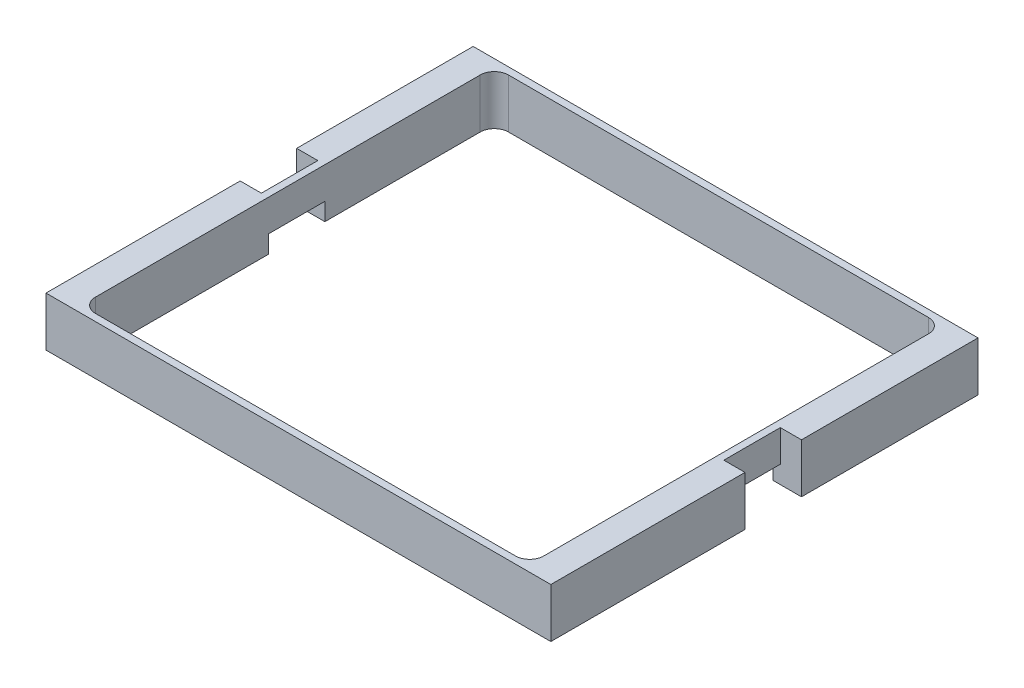
ISO-10303-21;
HEADER;
FILE_DESCRIPTION(('STEP AP214'),'2;1');
FILE_NAME('part.step','',(''),(''),'','','');
FILE_SCHEMA(('AUTOMOTIVE_DESIGN { 1 0 10303 214 1 1 1 1 }'));
ENDSEC;
DATA;
#1=APPLICATION_CONTEXT('core data for automotive mechanical design processes');
#2=APPLICATION_PROTOCOL_DEFINITION('international standard','automotive_design',2000,#1);
#3=PRODUCT_CONTEXT('',#1,'mechanical');
#4=PRODUCT('Part','Part','',(#3));
#5=PRODUCT_RELATED_PRODUCT_CATEGORY('part','',(#4));
#6=PRODUCT_DEFINITION_FORMATION('','',#4);
#7=PRODUCT_DEFINITION_CONTEXT('part definition',#1,'design');
#8=PRODUCT_DEFINITION('design','',#6,#7);
#9=PRODUCT_DEFINITION_SHAPE('','',#8);
#10=(LENGTH_UNIT() NAMED_UNIT(*) SI_UNIT(.MILLI.,.METRE.));
#11=(NAMED_UNIT(*) PLANE_ANGLE_UNIT() SI_UNIT($,.RADIAN.));
#12=(NAMED_UNIT(*) SI_UNIT($,.STERADIAN.) SOLID_ANGLE_UNIT());
#13=UNCERTAINTY_MEASURE_WITH_UNIT(LENGTH_MEASURE(1.E-05),#10,'distance_accuracy_value','');
#14=(GEOMETRIC_REPRESENTATION_CONTEXT(3) GLOBAL_UNCERTAINTY_ASSIGNED_CONTEXT((#13)) GLOBAL_UNIT_ASSIGNED_CONTEXT((#10,
#11,#12)) REPRESENTATION_CONTEXT('',''));
#15=CARTESIAN_POINT('',(0.,0.,0.));
#16=DIRECTION('',(0.,0.,1.));
#17=DIRECTION('',(1.,0.,0.));
#18=AXIS2_PLACEMENT_3D('',#15,#16,#17);
#19=CARTESIAN_POINT('',(0.,0.,0.));
#20=DIRECTION('',(0.,1.,0.));
#21=DIRECTION('',(0.,0.,1.));
#22=AXIS2_PLACEMENT_3D('',#19,#20,#21);
#23=PLANE('',#22);
#24=DIRECTION('',(1.,0.,0.));
#25=VECTOR('',#24,1.);
#26=CARTESIAN_POINT('',(-4.,0.,32.));
#27=LINE('',#26,#25);
#28=CARTESIAN_POINT('',(-4.,0.,32.));
#29=VERTEX_POINT('',#28);
#30=CARTESIAN_POINT('',(0.,0.,32.));
#31=VERTEX_POINT('',#30);
#32=EDGE_CURVE('E62',#29,#31,#27,.T.);
#33=ORIENTED_EDGE('',*,*,#32,.T.);
#34=DIRECTION('',(0.,0.,1.));
#35=VECTOR('',#34,1.);
#36=CARTESIAN_POINT('',(0.,0.,0.));
#37=LINE('',#36,#35);
#38=CARTESIAN_POINT('',(0.,0.,56.5));
#39=VERTEX_POINT('',#38);
#40=EDGE_CURVE('E262',#31,#39,#37,.T.);
#41=ORIENTED_EDGE('',*,*,#40,.T.);
#42=CARTESIAN_POINT('',(2.00000000000001,0.,56.5));
#43=DIRECTION('',(0.,1.,0.));
#44=DIRECTION('',(0.,0.,1.));
#45=AXIS2_PLACEMENT_3D('',#42,#43,#44);
#46=CIRCLE('',#45,2.);
#47=CARTESIAN_POINT('',(2.00000000000001,0.,58.5));
#48=VERTEX_POINT('',#47);
#49=EDGE_CURVE('E330',#39,#48,#46,.T.);
#50=ORIENTED_EDGE('',*,*,#49,.T.);
#51=DIRECTION('',(1.,0.,0.));
#52=VECTOR('',#51,1.);
#53=CARTESIAN_POINT('',(0.,0.,58.5));
#54=LINE('',#53,#52);
#55=CARTESIAN_POINT('',(61.5,0.,58.5));
#56=VERTEX_POINT('',#55);
#57=EDGE_CURVE('E261',#48,#56,#54,.T.);
#58=ORIENTED_EDGE('',*,*,#57,.T.);
#59=CARTESIAN_POINT('',(61.5,0.,56.5));
#60=DIRECTION('',(0.,1.,0.));
#61=DIRECTION('',(0.,0.,1.));
#62=AXIS2_PLACEMENT_3D('',#59,#60,#61);
#63=CIRCLE('',#62,2.);
#64=CARTESIAN_POINT('',(63.5,0.,56.5));
#65=VERTEX_POINT('',#64);
#66=EDGE_CURVE('E326',#56,#65,#63,.T.);
#67=ORIENTED_EDGE('',*,*,#66,.T.);
#68=DIRECTION('',(0.,0.,-1.));
#69=VECTOR('',#68,1.);
#70=CARTESIAN_POINT('',(63.5,0.,0.));
#71=LINE('',#70,#69);
#72=CARTESIAN_POINT('',(63.5,0.,32.));
#73=VERTEX_POINT('',#72);
#74=EDGE_CURVE('E266',#65,#73,#71,.T.);
#75=ORIENTED_EDGE('',*,*,#74,.T.);
#76=DIRECTION('',(1.,0.,0.));
#77=VECTOR('',#76,1.);
#78=CARTESIAN_POINT('',(67.5,0.,32.));
#79=LINE('',#78,#77);
#80=CARTESIAN_POINT('',(67.5,0.,32.));
#81=VERTEX_POINT('',#80);
#82=EDGE_CURVE('E225',#73,#81,#79,.T.);
#83=ORIENTED_EDGE('',*,*,#82,.T.);
#84=DIRECTION('',(0.,0.,-1.));
#85=VECTOR('',#84,1.);
#86=CARTESIAN_POINT('',(67.5,0.,-1.));
#87=LINE('',#86,#85);
#88=CARTESIAN_POINT('',(67.5,0.,59.5));
#89=VERTEX_POINT('',#88);
#90=EDGE_CURVE('E290',#89,#81,#87,.T.);
#91=ORIENTED_EDGE('',*,*,#90,.F.);
#92=DIRECTION('',(1.,0.,0.));
#93=VECTOR('',#92,1.);
#94=CARTESIAN_POINT('',(-3.99999999999999,0.,59.5));
#95=LINE('',#94,#93);
#96=CARTESIAN_POINT('',(-3.99999999999999,0.,59.5));
#97=VERTEX_POINT('',#96);
#98=EDGE_CURVE('E287',#97,#89,#95,.T.);
#99=ORIENTED_EDGE('',*,*,#98,.F.);
#100=DIRECTION('',(0.,0.,1.));
#101=VECTOR('',#100,1.);
#102=CARTESIAN_POINT('',(-4.,0.,-1.));
#103=LINE('',#102,#101);
#104=EDGE_CURVE('E257',#29,#97,#103,.T.);
#105=ORIENTED_EDGE('',*,*,#104,.F.);
#106=EDGE_LOOP('',(#33,#41,#50,#58,#67,#75,#83,#91,#99,#105));
#107=FACE_BOUND('',#106,.T.);
#108=ADVANCED_FACE('F39',(#107),#23,.F.);
#109=CARTESIAN_POINT('',(-4.,7.,-1.));
#110=DIRECTION('',(1.,0.,0.));
#111=DIRECTION('',(0.,0.,-1.));
#112=AXIS2_PLACEMENT_3D('',#109,#110,#111);
#113=PLANE('',#112);
#114=CARTESIAN_POINT('',(-4.,0.,-1.));
#115=VERTEX_POINT('',#114);
#116=CARTESIAN_POINT('',(-4.,0.,24.));
#117=VERTEX_POINT('',#116);
#118=EDGE_CURVE('E284',#115,#117,#103,.T.);
#119=ORIENTED_EDGE('',*,*,#118,.T.);
#120=DIRECTION('',(0.,1.,0.));
#121=VECTOR('',#120,1.);
#122=CARTESIAN_POINT('',(-4.,0.,24.));
#123=LINE('',#122,#121);
#124=CARTESIAN_POINT('',(-4.,7.,24.));
#125=VERTEX_POINT('',#124);
#126=EDGE_CURVE('E387',#117,#125,#123,.T.);
#127=ORIENTED_EDGE('',*,*,#126,.T.);
#128=DIRECTION('',(0.,0.,1.));
#129=VECTOR('',#128,1.);
#130=CARTESIAN_POINT('',(-4.,7.,-1.));
#131=LINE('',#130,#129);
#132=CARTESIAN_POINT('',(-4.,7.,-1.));
#133=VERTEX_POINT('',#132);
#134=EDGE_CURVE('E271',#133,#125,#131,.T.);
#135=ORIENTED_EDGE('',*,*,#134,.F.);
#136=DIRECTION('',(0.,-1.,0.));
#137=VECTOR('',#136,1.);
#138=CARTESIAN_POINT('',(-4.,7.,-1.));
#139=LINE('',#138,#137);
#140=EDGE_CURVE('E283',#133,#115,#139,.T.);
#141=ORIENTED_EDGE('',*,*,#140,.T.);
#142=EDGE_LOOP('',(#119,#127,#135,#141));
#143=FACE_BOUND('',#142,.T.);
#144=ADVANCED_FACE('F418',(#143),#113,.F.);
#145=CARTESIAN_POINT('',(67.5,7.,-1.));
#146=DIRECTION('',(-1.,0.,0.));
#147=DIRECTION('',(0.,0.,1.));
#148=AXIS2_PLACEMENT_3D('',#145,#146,#147);
#149=PLANE('',#148);
#150=ORIENTED_EDGE('',*,*,#90,.T.);
#151=DIRECTION('',(0.,1.,0.));
#152=VECTOR('',#151,1.);
#153=CARTESIAN_POINT('',(67.5,0.,32.));
#154=LINE('',#153,#152);
#155=CARTESIAN_POINT('',(67.5,7.,32.));
#156=VERTEX_POINT('',#155);
#157=EDGE_CURVE('E227',#81,#156,#154,.T.);
#158=ORIENTED_EDGE('',*,*,#157,.T.);
#159=DIRECTION('',(0.,0.,-1.));
#160=VECTOR('',#159,1.);
#161=CARTESIAN_POINT('',(67.5,7.,-1.));
#162=LINE('',#161,#160);
#163=CARTESIAN_POINT('',(67.5,7.,59.5));
#164=VERTEX_POINT('',#163);
#165=EDGE_CURVE('E278',#164,#156,#162,.T.);
#166=ORIENTED_EDGE('',*,*,#165,.F.);
#167=DIRECTION('',(0.,-1.,0.));
#168=VECTOR('',#167,1.);
#169=CARTESIAN_POINT('',(67.5,7.,59.5));
#170=LINE('',#169,#168);
#171=EDGE_CURVE('E300',#164,#89,#170,.T.);
#172=ORIENTED_EDGE('',*,*,#171,.T.);
#173=EDGE_LOOP('',(#150,#158,#166,#172));
#174=FACE_BOUND('',#173,.T.);
#175=ADVANCED_FACE('F433',(#174),#149,.F.);
#176=CARTESIAN_POINT('',(0.,7.,0.));
#177=DIRECTION('',(0.,1.,0.));
#178=DIRECTION('',(0.,0.,1.));
#179=AXIS2_PLACEMENT_3D('',#176,#177,#178);
#180=PLANE('',#179);
#181=DIRECTION('',(-1.,0.,0.));
#182=VECTOR('',#181,1.);
#183=CARTESIAN_POINT('',(-4.,7.,24.));
#184=LINE('',#183,#182);
#185=CARTESIAN_POINT('',(-1.,7.,24.));
#186=VERTEX_POINT('',#185);
#187=EDGE_CURVE('E396',#186,#125,#184,.T.);
#188=ORIENTED_EDGE('',*,*,#187,.F.);
#189=DIRECTION('',(0.,0.,-1.));
#190=VECTOR('',#189,1.);
#191=CARTESIAN_POINT('',(-1.,7.,24.));
#192=LINE('',#191,#190);
#193=CARTESIAN_POINT('',(-0.999999999999999,7.,32.));
#194=VERTEX_POINT('',#193);
#195=EDGE_CURVE('E408',#194,#186,#192,.T.);
#196=ORIENTED_EDGE('',*,*,#195,.F.);
#197=DIRECTION('',(1.,0.,0.));
#198=VECTOR('',#197,1.);
#199=CARTESIAN_POINT('',(-4.,7.,32.));
#200=LINE('',#199,#198);
#201=CARTESIAN_POINT('',(-4.,7.,32.));
#202=VERTEX_POINT('',#201);
#203=EDGE_CURVE('E240',#202,#194,#200,.T.);
#204=ORIENTED_EDGE('',*,*,#203,.F.);
#205=CARTESIAN_POINT('',(-3.99999999999999,7.,59.5));
#206=VERTEX_POINT('',#205);
#207=EDGE_CURVE('E275',#202,#206,#131,.T.);
#208=ORIENTED_EDGE('',*,*,#207,.T.);
#209=DIRECTION('',(1.,0.,0.));
#210=VECTOR('',#209,1.);
#211=CARTESIAN_POINT('',(-3.99999999999999,7.,59.5));
#212=LINE('',#211,#210);
#213=EDGE_CURVE('E274',#206,#164,#212,.T.);
#214=ORIENTED_EDGE('',*,*,#213,.T.);
#215=ORIENTED_EDGE('',*,*,#165,.T.);
#216=DIRECTION('',(1.,0.,0.));
#217=VECTOR('',#216,1.);
#218=CARTESIAN_POINT('',(67.5,7.,32.));
#219=LINE('',#218,#217);
#220=CARTESIAN_POINT('',(64.5,7.,32.));
#221=VERTEX_POINT('',#220);
#222=EDGE_CURVE('E234',#221,#156,#219,.T.);
#223=ORIENTED_EDGE('',*,*,#222,.F.);
#224=DIRECTION('',(0.,0.,1.));
#225=VECTOR('',#224,1.);
#226=CARTESIAN_POINT('',(64.5,7.,24.));
#227=LINE('',#226,#225);
#228=CARTESIAN_POINT('',(64.5,7.,24.));
#229=VERTEX_POINT('',#228);
#230=EDGE_CURVE('E236',#229,#221,#227,.T.);
#231=ORIENTED_EDGE('',*,*,#230,.F.);
#232=DIRECTION('',(-1.,0.,0.));
#233=VECTOR('',#232,1.);
#234=CARTESIAN_POINT('',(67.5,7.,24.));
#235=LINE('',#234,#233);
#236=CARTESIAN_POINT('',(67.5,7.,24.));
#237=VERTEX_POINT('',#236);
#238=EDGE_CURVE('E221',#237,#229,#235,.T.);
#239=ORIENTED_EDGE('',*,*,#238,.F.);
#240=CARTESIAN_POINT('',(67.5,7.,-1.));
#241=VERTEX_POINT('',#240);
#242=EDGE_CURVE('E277',#237,#241,#162,.T.);
#243=ORIENTED_EDGE('',*,*,#242,.T.);
#244=DIRECTION('',(-1.,0.,0.));
#245=VECTOR('',#244,1.);
#246=CARTESIAN_POINT('',(-4.,7.,-1.));
#247=LINE('',#246,#245);
#248=EDGE_CURVE('E281',#241,#133,#247,.T.);
#249=ORIENTED_EDGE('',*,*,#248,.T.);
#250=ORIENTED_EDGE('',*,*,#134,.T.);
#251=EDGE_LOOP('',(#188,#196,#204,#208,#214,#215,#223,#231,#239,#243,#249,#250));
#252=FACE_BOUND('',#251,.T.);
#253=DIRECTION('',(1.,0.,0.));
#254=VECTOR('',#253,1.);
#255=CARTESIAN_POINT('',(0.,7.,58.5));
#256=LINE('',#255,#254);
#257=CARTESIAN_POINT('',(2.00000000000001,7.,58.5));
#258=VERTEX_POINT('',#257);
#259=CARTESIAN_POINT('',(61.5,7.,58.5));
#260=VERTEX_POINT('',#259);
#261=EDGE_CURVE('E247',#258,#260,#256,.T.);
#262=ORIENTED_EDGE('',*,*,#261,.F.);
#263=CARTESIAN_POINT('',(2.00000000000001,7.,56.5));
#264=DIRECTION('',(0.,1.,0.));
#265=DIRECTION('',(0.,0.,1.));
#266=AXIS2_PLACEMENT_3D('',#263,#264,#265);
#267=CIRCLE('',#266,2.);
#268=CARTESIAN_POINT('',(0.,7.,56.5));
#269=VERTEX_POINT('',#268);
#270=EDGE_CURVE('E332',#258,#269,#267,.F.);
#271=ORIENTED_EDGE('',*,*,#270,.T.);
#272=DIRECTION('',(0.,0.,1.));
#273=VECTOR('',#272,1.);
#274=CARTESIAN_POINT('',(0.,7.,0.));
#275=LINE('',#274,#273);
#276=CARTESIAN_POINT('',(0.,7.,2.));
#277=VERTEX_POINT('',#276);
#278=EDGE_CURVE('E244',#277,#269,#275,.T.);
#279=ORIENTED_EDGE('',*,*,#278,.F.);
#280=CARTESIAN_POINT('',(2.,7.,2.));
#281=DIRECTION('',(0.,1.,0.));
#282=DIRECTION('',(0.,0.,1.));
#283=AXIS2_PLACEMENT_3D('',#280,#281,#282);
#284=CIRCLE('',#283,2.);
#285=CARTESIAN_POINT('',(2.,7.,0.));
#286=VERTEX_POINT('',#285);
#287=EDGE_CURVE('E11',#277,#286,#284,.F.);
#288=ORIENTED_EDGE('',*,*,#287,.T.);
#289=DIRECTION('',(-1.,0.,0.));
#290=VECTOR('',#289,1.);
#291=CARTESIAN_POINT('',(0.,7.,0.));
#292=LINE('',#291,#290);
#293=CARTESIAN_POINT('',(61.5,7.,0.));
#294=VERTEX_POINT('',#293);
#295=EDGE_CURVE('E254',#294,#286,#292,.T.);
#296=ORIENTED_EDGE('',*,*,#295,.F.);
#297=CARTESIAN_POINT('',(61.5,7.,2.));
#298=DIRECTION('',(0.,1.,0.));
#299=DIRECTION('',(0.,0.,1.));
#300=AXIS2_PLACEMENT_3D('',#297,#298,#299);
#301=CIRCLE('',#300,2.);
#302=CARTESIAN_POINT('',(63.5,7.,2.));
#303=VERTEX_POINT('',#302);
#304=EDGE_CURVE('E336',#294,#303,#301,.F.);
#305=ORIENTED_EDGE('',*,*,#304,.T.);
#306=DIRECTION('',(0.,0.,-1.));
#307=VECTOR('',#306,1.);
#308=CARTESIAN_POINT('',(63.5,7.,0.));
#309=LINE('',#308,#307);
#310=CARTESIAN_POINT('',(63.5,7.,56.5));
#311=VERTEX_POINT('',#310);
#312=EDGE_CURVE('E251',#311,#303,#309,.T.);
#313=ORIENTED_EDGE('',*,*,#312,.F.);
#314=CARTESIAN_POINT('',(61.5,7.,56.5));
#315=DIRECTION('',(0.,1.,0.));
#316=DIRECTION('',(0.,0.,1.));
#317=AXIS2_PLACEMENT_3D('',#314,#315,#316);
#318=CIRCLE('',#317,2.);
#319=EDGE_CURVE('E328',#311,#260,#318,.F.);
#320=ORIENTED_EDGE('',*,*,#319,.T.);
#321=EDGE_LOOP('',(#262,#271,#279,#288,#296,#305,#313,#320));
#322=FACE_BOUND('',#321,.T.);
#323=ADVANCED_FACE('F356',(#252,#322),#180,.T.);
#324=DIRECTION('',(-1.,0.,0.));
#325=VECTOR('',#324,1.);
#326=CARTESIAN_POINT('',(67.5,0.,24.));
#327=LINE('',#326,#325);
#328=CARTESIAN_POINT('',(67.5,0.,24.));
#329=VERTEX_POINT('',#328);
#330=CARTESIAN_POINT('',(63.5,0.,24.));
#331=VERTEX_POINT('',#330);
#332=EDGE_CURVE('E237',#329,#331,#327,.T.);
#333=ORIENTED_EDGE('',*,*,#332,.T.);
#334=CARTESIAN_POINT('',(63.5,0.,2.));
#335=VERTEX_POINT('',#334);
#336=EDGE_CURVE('E265',#331,#335,#71,.T.);
#337=ORIENTED_EDGE('',*,*,#336,.T.);
#338=CARTESIAN_POINT('',(61.5,0.,2.));
#339=DIRECTION('',(0.,1.,0.));
#340=DIRECTION('',(0.,0.,1.));
#341=AXIS2_PLACEMENT_3D('',#338,#339,#340);
#342=CIRCLE('',#341,2.);
#343=CARTESIAN_POINT('',(61.5,0.,0.));
#344=VERTEX_POINT('',#343);
#345=EDGE_CURVE('E334',#335,#344,#342,.T.);
#346=ORIENTED_EDGE('',*,*,#345,.T.);
#347=DIRECTION('',(-1.,0.,0.));
#348=VECTOR('',#347,1.);
#349=CARTESIAN_POINT('',(0.,0.,0.));
#350=LINE('',#349,#348);
#351=CARTESIAN_POINT('',(2.,0.,0.));
#352=VERTEX_POINT('',#351);
#353=EDGE_CURVE('E248',#344,#352,#350,.T.);
#354=ORIENTED_EDGE('',*,*,#353,.T.);
#355=CARTESIAN_POINT('',(2.,0.,2.));
#356=DIRECTION('',(0.,1.,0.));
#357=DIRECTION('',(0.,0.,1.));
#358=AXIS2_PLACEMENT_3D('',#355,#356,#357);
#359=CIRCLE('',#358,2.);
#360=CARTESIAN_POINT('',(0.,0.,2.));
#361=VERTEX_POINT('',#360);
#362=EDGE_CURVE('E47',#352,#361,#359,.T.);
#363=ORIENTED_EDGE('',*,*,#362,.T.);
#364=CARTESIAN_POINT('',(0.,0.,24.));
#365=VERTEX_POINT('',#364);
#366=EDGE_CURVE('E258',#361,#365,#37,.T.);
#367=ORIENTED_EDGE('',*,*,#366,.T.);
#368=DIRECTION('',(-1.,0.,0.));
#369=VECTOR('',#368,1.);
#370=CARTESIAN_POINT('',(-4.,0.,24.));
#371=LINE('',#370,#369);
#372=EDGE_CURVE('E400',#365,#117,#371,.T.);
#373=ORIENTED_EDGE('',*,*,#372,.T.);
#374=ORIENTED_EDGE('',*,*,#118,.F.);
#375=DIRECTION('',(-1.,0.,0.));
#376=VECTOR('',#375,1.);
#377=CARTESIAN_POINT('',(-4.,0.,-1.));
#378=LINE('',#377,#376);
#379=CARTESIAN_POINT('',(67.5,0.,-1.));
#380=VERTEX_POINT('',#379);
#381=EDGE_CURVE('E293',#380,#115,#378,.T.);
#382=ORIENTED_EDGE('',*,*,#381,.F.);
#383=EDGE_CURVE('E289',#329,#380,#87,.T.);
#384=ORIENTED_EDGE('',*,*,#383,.F.);
#385=EDGE_LOOP('',(#333,#337,#346,#354,#363,#367,#373,#374,#382,#384));
#386=FACE_BOUND('',#385,.T.);
#387=ADVANCED_FACE('F339',(#386),#23,.F.);
#388=ORIENTED_EDGE('',*,*,#207,.F.);
#389=DIRECTION('',(0.,1.,0.));
#390=VECTOR('',#389,1.);
#391=CARTESIAN_POINT('',(-4.,0.,32.));
#392=LINE('',#391,#390);
#393=EDGE_CURVE('E399',#29,#202,#392,.T.);
#394=ORIENTED_EDGE('',*,*,#393,.F.);
#395=ORIENTED_EDGE('',*,*,#104,.T.);
#396=DIRECTION('',(0.,-1.,0.));
#397=VECTOR('',#396,1.);
#398=CARTESIAN_POINT('',(-3.99999999999999,7.,59.5));
#399=LINE('',#398,#397);
#400=EDGE_CURVE('E303',#206,#97,#399,.T.);
#401=ORIENTED_EDGE('',*,*,#400,.F.);
#402=EDGE_LOOP('',(#388,#394,#395,#401));
#403=FACE_BOUND('',#402,.T.);
#404=ADVANCED_FACE('F475',(#403),#113,.F.);
#405=CARTESIAN_POINT('',(-3.99999999999999,7.,59.5));
#406=DIRECTION('',(0.,0.,-1.));
#407=DIRECTION('',(-1.,0.,0.));
#408=AXIS2_PLACEMENT_3D('',#405,#406,#407);
#409=PLANE('',#408);
#410=ORIENTED_EDGE('',*,*,#98,.T.);
#411=ORIENTED_EDGE('',*,*,#171,.F.);
#412=ORIENTED_EDGE('',*,*,#213,.F.);
#413=ORIENTED_EDGE('',*,*,#400,.T.);
#414=EDGE_LOOP('',(#410,#411,#412,#413));
#415=FACE_BOUND('',#414,.T.);
#416=ADVANCED_FACE('F482',(#415),#409,.F.);
#417=ORIENTED_EDGE('',*,*,#242,.F.);
#418=DIRECTION('',(0.,1.,0.));
#419=VECTOR('',#418,1.);
#420=CARTESIAN_POINT('',(67.5,0.,24.));
#421=LINE('',#420,#419);
#422=EDGE_CURVE('E223',#329,#237,#421,.T.);
#423=ORIENTED_EDGE('',*,*,#422,.F.);
#424=ORIENTED_EDGE('',*,*,#383,.T.);
#425=DIRECTION('',(0.,-1.,0.));
#426=VECTOR('',#425,1.);
#427=CARTESIAN_POINT('',(67.5,7.,-1.));
#428=LINE('',#427,#426);
#429=EDGE_CURVE('E297',#241,#380,#428,.T.);
#430=ORIENTED_EDGE('',*,*,#429,.F.);
#431=EDGE_LOOP('',(#417,#423,#424,#430));
#432=FACE_BOUND('',#431,.T.);
#433=ADVANCED_FACE('F426',(#432),#149,.F.);
#434=CARTESIAN_POINT('',(-4.,7.,-1.));
#435=DIRECTION('',(0.,0.,1.));
#436=DIRECTION('',(1.,0.,0.));
#437=AXIS2_PLACEMENT_3D('',#434,#435,#436);
#438=PLANE('',#437);
#439=ORIENTED_EDGE('',*,*,#381,.T.);
#440=ORIENTED_EDGE('',*,*,#140,.F.);
#441=ORIENTED_EDGE('',*,*,#248,.F.);
#442=ORIENTED_EDGE('',*,*,#429,.T.);
#443=EDGE_LOOP('',(#439,#440,#441,#442));
#444=FACE_BOUND('',#443,.T.);
#445=ADVANCED_FACE('F422',(#444),#438,.F.);
#446=CARTESIAN_POINT('',(0.,7.,0.));
#447=DIRECTION('',(1.,0.,0.));
#448=DIRECTION('',(0.,0.,-1.));
#449=AXIS2_PLACEMENT_3D('',#446,#447,#448);
#450=PLANE('',#449);
#451=DIRECTION('',(0.,-1.,0.));
#452=VECTOR('',#451,1.);
#453=CARTESIAN_POINT('',(0.,7.,32.));
#454=LINE('',#453,#452);
#455=CARTESIAN_POINT('',(0.,2.5,32.));
#456=VERTEX_POINT('',#455);
#457=EDGE_CURVE('E233',#456,#31,#454,.T.);
#458=ORIENTED_EDGE('',*,*,#457,.F.);
#459=DIRECTION('',(0.,0.,1.));
#460=VECTOR('',#459,1.);
#461=CARTESIAN_POINT('',(0.,2.5,0.));
#462=LINE('',#461,#460);
#463=CARTESIAN_POINT('',(0.,2.5,24.));
#464=VERTEX_POINT('',#463);
#465=EDGE_CURVE('E444',#464,#456,#462,.T.);
#466=ORIENTED_EDGE('',*,*,#465,.F.);
#467=DIRECTION('',(0.,1.,0.));
#468=VECTOR('',#467,1.);
#469=CARTESIAN_POINT('',(0.,7.,24.));
#470=LINE('',#469,#468);
#471=EDGE_CURVE('E351',#365,#464,#470,.T.);
#472=ORIENTED_EDGE('',*,*,#471,.F.);
#473=ORIENTED_EDGE('',*,*,#366,.F.);
#474=DIRECTION('',(0.,-1.,0.));
#475=VECTOR('',#474,1.);
#476=CARTESIAN_POINT('',(0.,7.,2.));
#477=LINE('',#476,#475);
#478=EDGE_CURVE('E316',#361,#277,#477,.F.);
#479=ORIENTED_EDGE('',*,*,#478,.T.);
#480=ORIENTED_EDGE('',*,*,#278,.T.);
#481=DIRECTION('',(0.,-1.,0.));
#482=VECTOR('',#481,1.);
#483=CARTESIAN_POINT('',(0.,0.,56.5));
#484=LINE('',#483,#482);
#485=EDGE_CURVE('E318',#269,#39,#484,.T.);
#486=ORIENTED_EDGE('',*,*,#485,.T.);
#487=ORIENTED_EDGE('',*,*,#40,.F.);
#488=EDGE_LOOP('',(#458,#466,#472,#473,#479,#480,#486,#487));
#489=FACE_BOUND('',#488,.T.);
#490=ADVANCED_FACE('F348',(#489),#450,.T.);
#491=CARTESIAN_POINT('',(0.,7.,58.5));
#492=DIRECTION('',(0.,0.,-1.));
#493=DIRECTION('',(-1.,0.,0.));
#494=AXIS2_PLACEMENT_3D('',#491,#492,#493);
#495=PLANE('',#494);
#496=ORIENTED_EDGE('',*,*,#261,.T.);
#497=DIRECTION('',(0.,-1.,0.));
#498=VECTOR('',#497,1.);
#499=CARTESIAN_POINT('',(61.5,0.,58.5));
#500=LINE('',#499,#498);
#501=EDGE_CURVE('E308',#260,#56,#500,.T.);
#502=ORIENTED_EDGE('',*,*,#501,.T.);
#503=ORIENTED_EDGE('',*,*,#57,.F.);
#504=DIRECTION('',(0.,-1.,0.));
#505=VECTOR('',#504,1.);
#506=CARTESIAN_POINT('',(2.00000000000001,7.,58.5));
#507=LINE('',#506,#505);
#508=EDGE_CURVE('E306',#48,#258,#507,.F.);
#509=ORIENTED_EDGE('',*,*,#508,.T.);
#510=EDGE_LOOP('',(#496,#502,#503,#509));
#511=FACE_BOUND('',#510,.T.);
#512=ADVANCED_FACE('F378',(#511),#495,.T.);
#513=CARTESIAN_POINT('',(63.5,7.,0.));
#514=DIRECTION('',(-1.,0.,0.));
#515=DIRECTION('',(0.,0.,1.));
#516=AXIS2_PLACEMENT_3D('',#513,#514,#515);
#517=PLANE('',#516);
#518=DIRECTION('',(0.,1.,0.));
#519=VECTOR('',#518,1.);
#520=CARTESIAN_POINT('',(63.5,7.,32.));
#521=LINE('',#520,#519);
#522=CARTESIAN_POINT('',(63.5,2.5,32.));
#523=VERTEX_POINT('',#522);
#524=EDGE_CURVE('E438',#73,#523,#521,.T.);
#525=ORIENTED_EDGE('',*,*,#524,.F.);
#526=ORIENTED_EDGE('',*,*,#74,.F.);
#527=DIRECTION('',(0.,-1.,0.));
#528=VECTOR('',#527,1.);
#529=CARTESIAN_POINT('',(63.5,7.,56.5));
#530=LINE('',#529,#528);
#531=EDGE_CURVE('E314',#65,#311,#530,.F.);
#532=ORIENTED_EDGE('',*,*,#531,.T.);
#533=ORIENTED_EDGE('',*,*,#312,.T.);
#534=DIRECTION('',(0.,-1.,0.));
#535=VECTOR('',#534,1.);
#536=CARTESIAN_POINT('',(63.5,0.,2.));
#537=LINE('',#536,#535);
#538=EDGE_CURVE('E311',#303,#335,#537,.T.);
#539=ORIENTED_EDGE('',*,*,#538,.T.);
#540=ORIENTED_EDGE('',*,*,#336,.F.);
#541=DIRECTION('',(0.,-1.,0.));
#542=VECTOR('',#541,1.);
#543=CARTESIAN_POINT('',(63.5,7.,24.));
#544=LINE('',#543,#542);
#545=CARTESIAN_POINT('',(63.5,2.5,24.));
#546=VERTEX_POINT('',#545);
#547=EDGE_CURVE('E440',#546,#331,#544,.T.);
#548=ORIENTED_EDGE('',*,*,#547,.F.);
#549=DIRECTION('',(0.,0.,-1.));
#550=VECTOR('',#549,1.);
#551=CARTESIAN_POINT('',(63.5,2.5,0.));
#552=LINE('',#551,#550);
#553=EDGE_CURVE('E206',#523,#546,#552,.T.);
#554=ORIENTED_EDGE('',*,*,#553,.F.);
#555=EDGE_LOOP('',(#525,#526,#532,#533,#539,#540,#548,#554));
#556=FACE_BOUND('',#555,.T.);
#557=ADVANCED_FACE('F369',(#556),#517,.T.);
#558=CARTESIAN_POINT('',(0.,7.,0.));
#559=DIRECTION('',(0.,0.,1.));
#560=DIRECTION('',(1.,0.,0.));
#561=AXIS2_PLACEMENT_3D('',#558,#559,#560);
#562=PLANE('',#561);
#563=ORIENTED_EDGE('',*,*,#353,.F.);
#564=DIRECTION('',(0.,-1.,0.));
#565=VECTOR('',#564,1.);
#566=CARTESIAN_POINT('',(61.5,7.,0.));
#567=LINE('',#566,#565);
#568=EDGE_CURVE('E324',#344,#294,#567,.F.);
#569=ORIENTED_EDGE('',*,*,#568,.T.);
#570=ORIENTED_EDGE('',*,*,#295,.T.);
#571=DIRECTION('',(0.,-1.,0.));
#572=VECTOR('',#571,1.);
#573=CARTESIAN_POINT('',(2.,0.,0.));
#574=LINE('',#573,#572);
#575=EDGE_CURVE('E321',#286,#352,#574,.T.);
#576=ORIENTED_EDGE('',*,*,#575,.T.);
#577=EDGE_LOOP('',(#563,#569,#570,#576));
#578=FACE_BOUND('',#577,.T.);
#579=ADVANCED_FACE('F359',(#578),#562,.T.);
#580=CARTESIAN_POINT('',(61.5,7.,56.5));
#581=DIRECTION('',(0.,1.,0.));
#582=DIRECTION('',(0.,0.,1.));
#583=AXIS2_PLACEMENT_3D('',#580,#581,#582);
#584=CYLINDRICAL_SURFACE('',#583,2.);
#585=ORIENTED_EDGE('',*,*,#319,.F.);
#586=ORIENTED_EDGE('',*,*,#531,.F.);
#587=ORIENTED_EDGE('',*,*,#66,.F.);
#588=ORIENTED_EDGE('',*,*,#501,.F.);
#589=EDGE_LOOP('',(#585,#586,#587,#588));
#590=FACE_BOUND('',#589,.T.);
#591=ADVANCED_FACE('F374',(#590),#584,.F.);
#592=CARTESIAN_POINT('',(2.00000000000001,7.,56.5));
#593=DIRECTION('',(0.,1.,0.));
#594=DIRECTION('',(0.,0.,1.));
#595=AXIS2_PLACEMENT_3D('',#592,#593,#594);
#596=CYLINDRICAL_SURFACE('',#595,2.);
#597=ORIENTED_EDGE('',*,*,#270,.F.);
#598=ORIENTED_EDGE('',*,*,#508,.F.);
#599=ORIENTED_EDGE('',*,*,#49,.F.);
#600=ORIENTED_EDGE('',*,*,#485,.F.);
#601=EDGE_LOOP('',(#597,#598,#599,#600));
#602=FACE_BOUND('',#601,.T.);
#603=ADVANCED_FACE('F383',(#602),#596,.F.);
#604=CARTESIAN_POINT('',(61.5,7.,2.));
#605=DIRECTION('',(0.,1.,0.));
#606=DIRECTION('',(0.,0.,1.));
#607=AXIS2_PLACEMENT_3D('',#604,#605,#606);
#608=CYLINDRICAL_SURFACE('',#607,2.);
#609=ORIENTED_EDGE('',*,*,#304,.F.);
#610=ORIENTED_EDGE('',*,*,#568,.F.);
#611=ORIENTED_EDGE('',*,*,#345,.F.);
#612=ORIENTED_EDGE('',*,*,#538,.F.);
#613=EDGE_LOOP('',(#609,#610,#611,#612));
#614=FACE_BOUND('',#613,.T.);
#615=ADVANCED_FACE('F363',(#614),#608,.F.);
#616=CARTESIAN_POINT('',(2.,7.,2.));
#617=DIRECTION('',(0.,1.,0.));
#618=DIRECTION('',(0.,0.,1.));
#619=AXIS2_PLACEMENT_3D('',#616,#617,#618);
#620=CYLINDRICAL_SURFACE('',#619,2.);
#621=ORIENTED_EDGE('',*,*,#287,.F.);
#622=ORIENTED_EDGE('',*,*,#478,.F.);
#623=ORIENTED_EDGE('',*,*,#362,.F.);
#624=ORIENTED_EDGE('',*,*,#575,.F.);
#625=EDGE_LOOP('',(#621,#622,#623,#624));
#626=FACE_BOUND('',#625,.T.);
#627=ADVANCED_FACE('F41',(#626),#620,.F.);
#628=CARTESIAN_POINT('',(67.5,0.,32.));
#629=DIRECTION('',(0.,0.,1.));
#630=DIRECTION('',(1.,0.,0.));
#631=AXIS2_PLACEMENT_3D('',#628,#629,#630);
#632=PLANE('',#631);
#633=ORIENTED_EDGE('',*,*,#222,.T.);
#634=ORIENTED_EDGE('',*,*,#157,.F.);
#635=ORIENTED_EDGE('',*,*,#82,.F.);
#636=ORIENTED_EDGE('',*,*,#524,.T.);
#637=DIRECTION('',(1.,0.,0.));
#638=VECTOR('',#637,1.);
#639=CARTESIAN_POINT('',(-4.,2.5,32.));
#640=LINE('',#639,#638);
#641=CARTESIAN_POINT('',(64.5,2.5,32.));
#642=VERTEX_POINT('',#641);
#643=EDGE_CURVE('E451',#523,#642,#640,.T.);
#644=ORIENTED_EDGE('',*,*,#643,.T.);
#645=DIRECTION('',(0.,1.,0.));
#646=VECTOR('',#645,1.);
#647=CARTESIAN_POINT('',(64.5,0.,32.));
#648=LINE('',#647,#646);
#649=EDGE_CURVE('E217',#642,#221,#648,.T.);
#650=ORIENTED_EDGE('',*,*,#649,.T.);
#651=EDGE_LOOP('',(#633,#634,#635,#636,#644,#650));
#652=FACE_BOUND('',#651,.T.);
#653=ADVANCED_FACE('F431',(#652),#632,.F.);
#654=CARTESIAN_POINT('',(64.5,0.,24.));
#655=DIRECTION('',(-1.,0.,0.));
#656=DIRECTION('',(0.,0.,1.));
#657=AXIS2_PLACEMENT_3D('',#654,#655,#656);
#658=PLANE('',#657);
#659=ORIENTED_EDGE('',*,*,#649,.F.);
#660=DIRECTION('',(0.,0.,1.));
#661=VECTOR('',#660,1.);
#662=CARTESIAN_POINT('',(64.5,2.5,32.));
#663=LINE('',#662,#661);
#664=CARTESIAN_POINT('',(64.5,2.5,24.));
#665=VERTEX_POINT('',#664);
#666=EDGE_CURVE('E203',#665,#642,#663,.T.);
#667=ORIENTED_EDGE('',*,*,#666,.F.);
#668=DIRECTION('',(0.,1.,0.));
#669=VECTOR('',#668,1.);
#670=CARTESIAN_POINT('',(64.5,0.,24.));
#671=LINE('',#670,#669);
#672=EDGE_CURVE('E215',#665,#229,#671,.T.);
#673=ORIENTED_EDGE('',*,*,#672,.T.);
#674=ORIENTED_EDGE('',*,*,#230,.T.);
#675=EDGE_LOOP('',(#659,#667,#673,#674));
#676=FACE_BOUND('',#675,.T.);
#677=ADVANCED_FACE('F213',(#676),#658,.F.);
#678=CARTESIAN_POINT('',(67.5,0.,24.));
#679=DIRECTION('',(0.,0.,-1.));
#680=DIRECTION('',(-1.,0.,0.));
#681=AXIS2_PLACEMENT_3D('',#678,#679,#680);
#682=PLANE('',#681);
#683=ORIENTED_EDGE('',*,*,#238,.T.);
#684=ORIENTED_EDGE('',*,*,#672,.F.);
#685=DIRECTION('',(1.,0.,0.));
#686=VECTOR('',#685,1.);
#687=CARTESIAN_POINT('',(-4.,2.5,24.));
#688=LINE('',#687,#686);
#689=EDGE_CURVE('E199',#546,#665,#688,.T.);
#690=ORIENTED_EDGE('',*,*,#689,.F.);
#691=ORIENTED_EDGE('',*,*,#547,.T.);
#692=ORIENTED_EDGE('',*,*,#332,.F.);
#693=ORIENTED_EDGE('',*,*,#422,.T.);
#694=EDGE_LOOP('',(#683,#684,#690,#691,#692,#693));
#695=FACE_BOUND('',#694,.T.);
#696=ADVANCED_FACE('F219',(#695),#682,.F.);
#697=CARTESIAN_POINT('',(-4.,0.,24.));
#698=DIRECTION('',(0.,0.,-1.));
#699=DIRECTION('',(-1.,0.,0.));
#700=AXIS2_PLACEMENT_3D('',#697,#698,#699);
#701=PLANE('',#700);
#702=ORIENTED_EDGE('',*,*,#187,.T.);
#703=ORIENTED_EDGE('',*,*,#126,.F.);
#704=ORIENTED_EDGE('',*,*,#372,.F.);
#705=ORIENTED_EDGE('',*,*,#471,.T.);
#706=CARTESIAN_POINT('',(-1.,2.5,24.));
#707=VERTEX_POINT('',#706);
#708=EDGE_CURVE('E54',#707,#464,#688,.T.);
#709=ORIENTED_EDGE('',*,*,#708,.F.);
#710=DIRECTION('',(0.,1.,0.));
#711=VECTOR('',#710,1.);
#712=CARTESIAN_POINT('',(-1.,0.,24.));
#713=LINE('',#712,#711);
#714=EDGE_CURVE('E388',#707,#186,#713,.T.);
#715=ORIENTED_EDGE('',*,*,#714,.T.);
#716=EDGE_LOOP('',(#702,#703,#704,#705,#709,#715));
#717=FACE_BOUND('',#716,.T.);
#718=ADVANCED_FACE('F414',(#717),#701,.F.);
#719=CARTESIAN_POINT('',(-1.,0.,24.));
#720=DIRECTION('',(1.,0.,0.));
#721=DIRECTION('',(0.,0.,-1.));
#722=AXIS2_PLACEMENT_3D('',#719,#720,#721);
#723=PLANE('',#722);
#724=ORIENTED_EDGE('',*,*,#714,.F.);
#725=DIRECTION('',(0.,0.,1.));
#726=VECTOR('',#725,1.);
#727=CARTESIAN_POINT('',(-1.,2.5,24.));
#728=LINE('',#727,#726);
#729=CARTESIAN_POINT('',(-1.,2.5,32.));
#730=VERTEX_POINT('',#729);
#731=EDGE_CURVE('E447',#707,#730,#728,.T.);
#732=ORIENTED_EDGE('',*,*,#731,.T.);
#733=DIRECTION('',(0.,1.,0.));
#734=VECTOR('',#733,1.);
#735=CARTESIAN_POINT('',(-0.999999999999999,0.,32.));
#736=LINE('',#735,#734);
#737=EDGE_CURVE('E393',#730,#194,#736,.T.);
#738=ORIENTED_EDGE('',*,*,#737,.T.);
#739=ORIENTED_EDGE('',*,*,#195,.T.);
#740=EDGE_LOOP('',(#724,#732,#738,#739));
#741=FACE_BOUND('',#740,.T.);
#742=ADVANCED_FACE('F456',(#741),#723,.F.);
#743=CARTESIAN_POINT('',(-4.,0.,32.));
#744=DIRECTION('',(0.,0.,1.));
#745=DIRECTION('',(1.,0.,0.));
#746=AXIS2_PLACEMENT_3D('',#743,#744,#745);
#747=PLANE('',#746);
#748=ORIENTED_EDGE('',*,*,#737,.F.);
#749=EDGE_CURVE('E449',#730,#456,#640,.T.);
#750=ORIENTED_EDGE('',*,*,#749,.T.);
#751=ORIENTED_EDGE('',*,*,#457,.T.);
#752=ORIENTED_EDGE('',*,*,#32,.F.);
#753=ORIENTED_EDGE('',*,*,#393,.T.);
#754=ORIENTED_EDGE('',*,*,#203,.T.);
#755=EDGE_LOOP('',(#748,#750,#751,#752,#753,#754));
#756=FACE_BOUND('',#755,.T.);
#757=ADVANCED_FACE('F458',(#756),#747,.F.);
#758=CARTESIAN_POINT('',(-4.,2.5,32.));
#759=DIRECTION('',(0.,1.,0.));
#760=DIRECTION('',(0.,0.,1.));
#761=AXIS2_PLACEMENT_3D('',#758,#759,#760);
#762=PLANE('',#761);
#763=ORIENTED_EDGE('',*,*,#465,.T.);
#764=ORIENTED_EDGE('',*,*,#749,.F.);
#765=ORIENTED_EDGE('',*,*,#731,.F.);
#766=ORIENTED_EDGE('',*,*,#708,.T.);
#767=EDGE_LOOP('',(#763,#764,#765,#766));
#768=FACE_BOUND('',#767,.T.);
#769=ADVANCED_FACE('F454',(#768),#762,.F.);
#770=ORIENTED_EDGE('',*,*,#553,.T.);
#771=ORIENTED_EDGE('',*,*,#689,.T.);
#772=ORIENTED_EDGE('',*,*,#666,.T.);
#773=ORIENTED_EDGE('',*,*,#643,.F.);
#774=EDGE_LOOP('',(#770,#771,#772,#773));
#775=FACE_BOUND('',#774,.T.);
#776=ADVANCED_FACE('F201',(#775),#762,.F.);
#777=CLOSED_SHELL('',(#108,#144,#175,#323,#387,#404,#416,#433,#445,#490,#512,#557,#579,#591,
#603,#615,#627,#653,#677,#696,#718,#742,#757,#769,#776));
#778=MANIFOLD_SOLID_BREP('B2',#777);
#779=ADVANCED_BREP_SHAPE_REPRESENTATION('',(#18,#778),#14);
#780=SHAPE_DEFINITION_REPRESENTATION(#9,#779);
ENDSEC;
END-ISO-10303-21;
